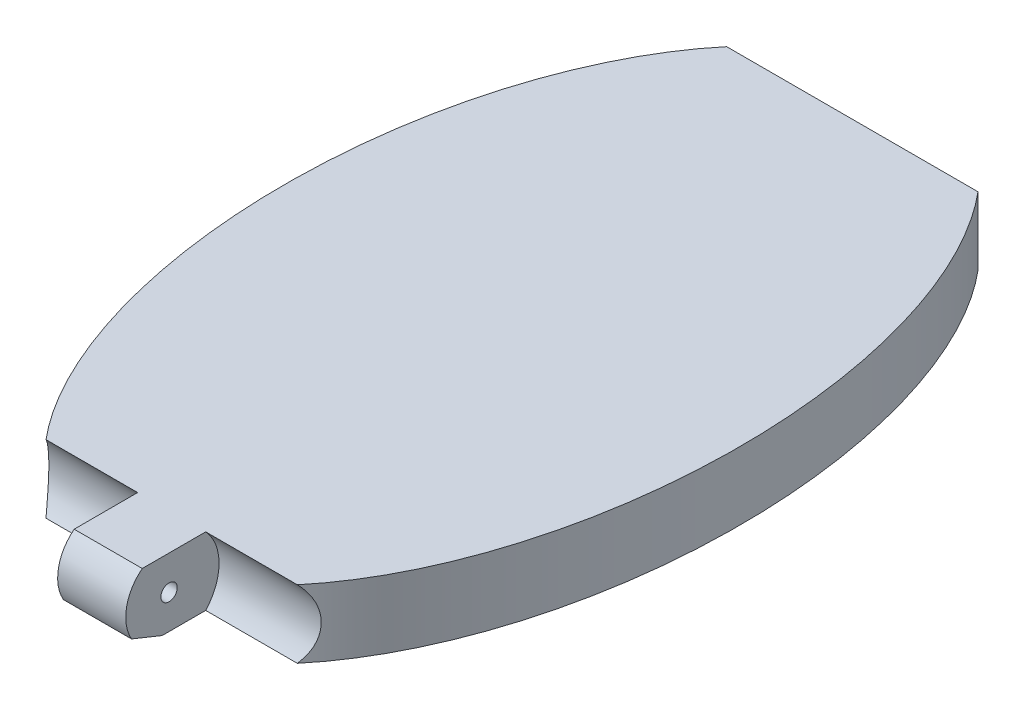
ISO-10303-21;
HEADER;
FILE_DESCRIPTION(('STEP AP214'),'2;1');
FILE_NAME('part.step','',(''),(''),'','','');
FILE_SCHEMA(('AUTOMOTIVE_DESIGN { 1 0 10303 214 1 1 1 1 }'));
ENDSEC;
DATA;
#1=APPLICATION_CONTEXT('core data for automotive mechanical design processes');
#2=APPLICATION_PROTOCOL_DEFINITION('international standard','automotive_design',2000,#1);
#3=PRODUCT_CONTEXT('',#1,'mechanical');
#4=PRODUCT('Part','Part','',(#3));
#5=PRODUCT_RELATED_PRODUCT_CATEGORY('part','',(#4));
#6=PRODUCT_DEFINITION_FORMATION('','',#4);
#7=PRODUCT_DEFINITION_CONTEXT('part definition',#1,'design');
#8=PRODUCT_DEFINITION('design','',#6,#7);
#9=PRODUCT_DEFINITION_SHAPE('','',#8);
#10=(LENGTH_UNIT() NAMED_UNIT(*) SI_UNIT(.MILLI.,.METRE.));
#11=(NAMED_UNIT(*) PLANE_ANGLE_UNIT() SI_UNIT($,.RADIAN.));
#12=(NAMED_UNIT(*) SI_UNIT($,.STERADIAN.) SOLID_ANGLE_UNIT());
#13=UNCERTAINTY_MEASURE_WITH_UNIT(LENGTH_MEASURE(1.E-05),#10,'distance_accuracy_value','');
#14=(GEOMETRIC_REPRESENTATION_CONTEXT(3) GLOBAL_UNCERTAINTY_ASSIGNED_CONTEXT((#13)) GLOBAL_UNIT_ASSIGNED_CONTEXT((#10,
#11,#12)) REPRESENTATION_CONTEXT('',''));
#15=CARTESIAN_POINT('',(0.,0.,0.));
#16=DIRECTION('',(0.,0.,1.));
#17=DIRECTION('',(1.,0.,0.));
#18=AXIS2_PLACEMENT_3D('',#15,#16,#17);
#19=CARTESIAN_POINT('',(0.,6.35,0.));
#20=DIRECTION('',(0.,1.,0.));
#21=DIRECTION('',(0.,0.,-1.));
#22=AXIS2_PLACEMENT_3D('',#19,#20,#21);
#23=ELLIPSE('',#22,38.1,21.209);
#24=DIRECTION('',(0.,-1.,0.));
#25=VECTOR('',#24,1.);
#26=SURFACE_OF_LINEAR_EXTRUSION('',#23,#25);
#27=CARTESIAN_POINT('',(11.723715863108,0.,31.75));
#28=CARTESIAN_POINT('',(11.7845177204,0.0779682282334768,31.6775519988626));
#29=CARTESIAN_POINT('',(11.8431216436233,0.159378838218593,31.6069041341866));
#30=CARTESIAN_POINT('',(11.9556030332646,0.328968422063535,31.4699489385228));
#31=CARTESIAN_POINT('',(12.0094768369523,0.417152543588789,31.403644981114));
#32=CARTESIAN_POINT('',(12.1123478074563,0.600542576899099,31.2758901209959));
#33=CARTESIAN_POINT('',(12.1613172930874,0.69578358601234,31.214467130077));
#34=CARTESIAN_POINT('',(12.2536509356972,0.8924925463359,31.0977181812722));
#35=CARTESIAN_POINT('',(12.297016404684,0.99395903180852,31.0423907967365));
#36=CARTESIAN_POINT('',(12.3779793667619,1.20317024236548,30.9383772547037));
#37=CARTESIAN_POINT('',(12.4155469416906,1.31094381701724,30.8897256797355));
#38=CARTESIAN_POINT('',(12.4842862550226,1.531634743187,30.8001899821188));
#39=CARTESIAN_POINT('',(12.515458580902,1.64455162106877,30.759305146033));
#40=CARTESIAN_POINT('',(12.5710162893371,1.87442920734551,30.6861061711093));
#41=CARTESIAN_POINT('',(12.5954185096747,1.99137905507335,30.6537707787336));
#42=CARTESIAN_POINT('',(12.6372665472636,2.22862225838479,30.598138518997));
#43=CARTESIAN_POINT('',(12.6547132330683,2.3489151945014,30.5748405231259));
#44=CARTESIAN_POINT('',(12.6811536805979,2.5804054421289,30.5394645857841));
#45=CARTESIAN_POINT('',(12.6907852148028,2.6914016994749,30.5265413157279));
#46=CARTESIAN_POINT('',(12.7040747518997,2.91438796091779,30.5086977327822));
#47=CARTESIAN_POINT('',(12.7077331898259,3.02637789204576,30.5037768370615));
#48=CARTESIAN_POINT('',(12.7090406534201,3.25049543143565,30.5020189403686));
#49=CARTESIAN_POINT('',(12.7066875170698,3.36262307472994,30.5051848477554));
#50=CARTESIAN_POINT('',(12.6959909636161,3.58607232564821,30.5195538654204));
#51=CARTESIAN_POINT('',(12.6876476954458,3.69739395324273,30.5307567758739));
#52=CARTESIAN_POINT('',(12.6657147091723,3.91189795798511,30.5601296353567));
#53=CARTESIAN_POINT('',(12.6524597267715,4.01517608593758,30.5778546503782));
#54=CARTESIAN_POINT('',(12.6208223686361,4.21958580553695,30.6200179750436));
#55=CARTESIAN_POINT('',(12.6024383338151,4.32071669120923,30.64445845689));
#56=CARTESIAN_POINT('',(12.5607026167589,4.520128322538,30.6997054144742));
#57=CARTESIAN_POINT('',(12.5373530044793,4.61841023648067,30.7305092374306));
#58=CARTESIAN_POINT('',(12.4858664029791,4.81162608409566,30.7980815308926));
#59=CARTESIAN_POINT('',(12.4577276965156,4.90655880204148,30.8348521407095));
#60=CARTESIAN_POINT('',(12.3639942686122,5.19300297288261,30.9566069382496));
#61=CARTESIAN_POINT('',(12.290739979369,5.37822048866549,31.0508100996239));
#62=CARTESIAN_POINT('',(12.1265002652541,5.72865943260798,31.2585022209354));
#63=CARTESIAN_POINT('',(12.035519136404,5.89388568986632,31.3719865073256));
#64=CARTESIAN_POINT('',(11.9030465800705,6.1011411908023,31.5340257091498));
#65=CARTESIAN_POINT('',(11.8683410788835,6.15275258314609,31.5762192974535));
#66=CARTESIAN_POINT('',(11.7972705507047,6.25332520903655,31.6620481717234));
#67=CARTESIAN_POINT('',(11.7609093689591,6.30229205829715,31.7056800581055));
#68=CARTESIAN_POINT('',(11.723715863108,6.35000000000001,31.75));
#69=B_SPLINE_CURVE_WITH_KNOTS('',3,(#27,#28,#29,#30,#31,#32,#33,#34,#35,#36,#37,#38,#39,#40,#41,
#42,#43,#44,#45,#46,#47,#48,#49,#50,#51,#52,#53,#54,#55,#56,#57,#58,#59,#60,#61,#62,#63,#64,#65,
#66,#67,#68),.UNSPECIFIED.,.F.,.F.,(4,2,2,2,2,2,2,2,2,2,2,2,2,2,2,2,2,2,2,2,4),(0.,
0.367697149456702,0.735676556376303,1.10562797120365,1.47549261576303,1.84720623442146,
2.21888569166802,2.58963229273443,2.96033258332431,3.2963761556501,3.63239525205999,
3.96853521226472,4.30466681527901,4.62117439471767,4.9377844732963,5.25426282728748,
5.5708549020725,6.22898499525695,6.88695579144818,7.11236993974105,7.33728490467142),.UNSPECIFIED.);
#70=CARTESIAN_POINT('',(11.723715863108,0.,31.75));
#71=VERTEX_POINT('',#70);
#72=CARTESIAN_POINT('',(11.723715863108,6.35,31.75));
#73=VERTEX_POINT('',#72);
#74=EDGE_CURVE('E207',#71,#73,#69,.T.);
#75=ORIENTED_EDGE('',*,*,#74,.F.);
#76=CARTESIAN_POINT('',(0.,0.,0.));
#77=DIRECTION('',(0.,1.,0.));
#78=DIRECTION('',(0.,0.,-1.));
#79=AXIS2_PLACEMENT_3D('',#76,#77,#78);
#80=ELLIPSE('',#79,38.1,21.209);
#81=CARTESIAN_POINT('',(11.723715863108,0.,-31.75));
#82=VERTEX_POINT('',#81);
#83=EDGE_CURVE('E56',#71,#82,#80,.T.);
#84=ORIENTED_EDGE('',*,*,#83,.T.);
#85=DIRECTION('',(0.,1.,0.));
#86=VECTOR('',#85,1.);
#87=CARTESIAN_POINT('',(11.723715863108,0.,-31.75));
#88=LINE('',#87,#86);
#89=CARTESIAN_POINT('',(11.723715863108,6.35,-31.75));
#90=VERTEX_POINT('',#89);
#91=EDGE_CURVE('E137',#82,#90,#88,.T.);
#92=ORIENTED_EDGE('',*,*,#91,.T.);
#93=EDGE_CURVE('E131',#73,#90,#23,.T.);
#94=ORIENTED_EDGE('',*,*,#93,.F.);
#95=EDGE_LOOP('',(#75,#84,#92,#94));
#96=FACE_BOUND('',#95,.T.);
#97=ADVANCED_FACE('F33',(#96),#26,.F.);
#98=CARTESIAN_POINT('',(-11.7237158631079,6.35,31.75));
#99=CARTESIAN_POINT('',(-11.7845177204,6.27203177176652,31.6775519988626));
#100=CARTESIAN_POINT('',(-11.8431216436233,6.1906211617814,31.6069041341866));
#101=CARTESIAN_POINT('',(-11.9556030332646,6.02103157793646,31.4699489385228));
#102=CARTESIAN_POINT('',(-12.0094768369522,5.9328474564112,31.403644981114));
#103=CARTESIAN_POINT('',(-12.1123478074563,5.7494574231009,31.2758901209959));
#104=CARTESIAN_POINT('',(-12.1613172930873,5.65421641398765,31.214467130077));
#105=CARTESIAN_POINT('',(-12.2536509356971,5.4575074536641,31.0977181812722));
#106=CARTESIAN_POINT('',(-12.297016404684,5.35604096819148,31.0423907967365));
#107=CARTESIAN_POINT('',(-12.3779793667619,5.14682975763452,30.9383772547037));
#108=CARTESIAN_POINT('',(-12.4155469416906,5.03905618298276,30.8897256797355));
#109=CARTESIAN_POINT('',(-12.4842862550226,4.81836525681299,30.8001899821188));
#110=CARTESIAN_POINT('',(-12.515458580902,4.70544837893123,30.759305146033));
#111=CARTESIAN_POINT('',(-12.5710162893371,4.4755707926545,30.6861061711093));
#112=CARTESIAN_POINT('',(-12.5954185096747,4.35862094492666,30.6537707787336));
#113=CARTESIAN_POINT('',(-12.6372665472636,4.12137774161521,30.598138518997));
#114=CARTESIAN_POINT('',(-12.6547132330683,4.0010848054986,30.5748405231259));
#115=CARTESIAN_POINT('',(-12.6811536805979,3.7695945578711,30.5394645857841));
#116=CARTESIAN_POINT('',(-12.6907852148028,3.65859830052511,30.5265413157279));
#117=CARTESIAN_POINT('',(-12.7040747518997,3.43561203908222,30.5086977327823));
#118=CARTESIAN_POINT('',(-12.7077331898259,3.32362210795424,30.5037768370615));
#119=CARTESIAN_POINT('',(-12.7090406534201,3.09950456856435,30.5020189403686));
#120=CARTESIAN_POINT('',(-12.7066875170698,2.98737692527006,30.5051848477554));
#121=CARTESIAN_POINT('',(-12.6959909636161,2.7639276743518,30.5195538654204));
#122=CARTESIAN_POINT('',(-12.6876476954458,2.65260604675728,30.5307567758739));
#123=CARTESIAN_POINT('',(-12.6657147091723,2.4381020420149,30.5601296353567));
#124=CARTESIAN_POINT('',(-12.6524597267715,2.33482391406242,30.5778546503782));
#125=CARTESIAN_POINT('',(-12.6208223686361,2.13041419446306,30.6200179750436));
#126=CARTESIAN_POINT('',(-12.6024383338151,2.02928330879077,30.64445845689));
#127=CARTESIAN_POINT('',(-12.5607026167589,1.82987167746201,30.6997054144742));
#128=CARTESIAN_POINT('',(-12.5373530044793,1.73158976351934,30.7305092374306));
#129=CARTESIAN_POINT('',(-12.4858664029791,1.53837391590435,30.7980815308926));
#130=CARTESIAN_POINT('',(-12.4577276965156,1.44344119795852,30.8348521407095));
#131=CARTESIAN_POINT('',(-12.3639942686122,1.1569970271174,30.9566069382496));
#132=CARTESIAN_POINT('',(-12.290739979369,0.971779511334517,31.0508100996239));
#133=CARTESIAN_POINT('',(-12.1265002652541,0.621340567392028,31.2585022209354));
#134=CARTESIAN_POINT('',(-12.035519136404,0.456114310133683,31.3719865073256));
#135=CARTESIAN_POINT('',(-11.9030465800705,0.248858809197714,31.5340257091498));
#136=CARTESIAN_POINT('',(-11.8683410788835,0.19724741685392,31.5762192974535));
#137=CARTESIAN_POINT('',(-11.7972705507047,0.096674790963465,31.6620481717234));
#138=CARTESIAN_POINT('',(-11.7609093689591,0.0477079417028635,31.7056800581055));
#139=CARTESIAN_POINT('',(-11.723715863108,0.,31.75));
#140=B_SPLINE_CURVE_WITH_KNOTS('',3,(#98,#99,#100,#101,#102,#103,#104,#105,#106,#107,#108,#109,
#110,#111,#112,#113,#114,#115,#116,#117,#118,#119,#120,#121,#122,#123,#124,#125,#126,#127,#128,
#129,#130,#131,#132,#133,#134,#135,#136,#137,#138,#139),.UNSPECIFIED.,.F.,.F.,(4,2,2,2,2,2,2,2,
2,2,2,2,2,2,2,2,2,2,2,2,4),(0.,0.367697149456702,0.735676556376302,1.10562797120365,
1.47549261576303,1.84720623442145,2.21888569166801,2.58963229273442,2.9603325833243,
3.29637615565009,3.63239525205997,3.96853521226471,4.30466681527899,4.62117439471766,
4.93778447329629,5.25426282728746,5.57085490207249,6.22898499525694,6.88695579144816,
7.11236993974103,7.33728490467139),.UNSPECIFIED.);
#141=CARTESIAN_POINT('',(-11.7237158631079,6.35,31.75));
#142=VERTEX_POINT('',#141);
#143=CARTESIAN_POINT('',(-11.723715863108,0.,31.75));
#144=VERTEX_POINT('',#143);
#145=EDGE_CURVE('E163',#142,#144,#140,.T.);
#146=ORIENTED_EDGE('',*,*,#145,.F.);
#147=CARTESIAN_POINT('',(-11.7237158631079,6.35,-31.75));
#148=VERTEX_POINT('',#147);
#149=EDGE_CURVE('E126',#148,#142,#23,.T.);
#150=ORIENTED_EDGE('',*,*,#149,.F.);
#151=DIRECTION('',(0.,1.,0.));
#152=VECTOR('',#151,1.);
#153=CARTESIAN_POINT('',(-11.7237158631079,0.,-31.75));
#154=LINE('',#153,#152);
#155=CARTESIAN_POINT('',(-11.7237158631079,0.,-31.75));
#156=VERTEX_POINT('',#155);
#157=EDGE_CURVE('E135',#156,#148,#154,.T.);
#158=ORIENTED_EDGE('',*,*,#157,.F.);
#159=EDGE_CURVE('E129',#156,#144,#80,.T.);
#160=ORIENTED_EDGE('',*,*,#159,.T.);
#161=EDGE_LOOP('',(#146,#150,#158,#160));
#162=FACE_BOUND('',#161,.T.);
#163=ADVANCED_FACE('F196',(#162),#26,.F.);
#164=CARTESIAN_POINT('',(0.,6.35,0.));
#165=DIRECTION('',(0.,1.,0.));
#166=DIRECTION('',(0.,0.,1.));
#167=AXIS2_PLACEMENT_3D('',#164,#165,#166);
#168=PLANE('',#167);
#169=DIRECTION('',(-1.,0.,0.));
#170=VECTOR('',#169,1.);
#171=CARTESIAN_POINT('',(21.209,6.35,37.6706653645493));
#172=LINE('',#171,#170);
#173=CARTESIAN_POINT('',(3.175,6.35,37.6706653645493));
#174=VERTEX_POINT('',#173);
#175=CARTESIAN_POINT('',(-3.175,6.35,37.6706653645493));
#176=VERTEX_POINT('',#175);
#177=EDGE_CURVE('E221',#174,#176,#172,.T.);
#178=ORIENTED_EDGE('',*,*,#177,.F.);
#179=DIRECTION('',(0.,0.,1.));
#180=VECTOR('',#179,1.);
#181=CARTESIAN_POINT('',(3.175,6.35,38.1));
#182=LINE('',#181,#180);
#183=CARTESIAN_POINT('',(3.175,6.35,31.75));
#184=VERTEX_POINT('',#183);
#185=EDGE_CURVE('E148',#184,#174,#182,.T.);
#186=ORIENTED_EDGE('',*,*,#185,.F.);
#187=DIRECTION('',(-1.,0.,0.));
#188=VECTOR('',#187,1.);
#189=CARTESIAN_POINT('',(3.175,6.35,31.75));
#190=LINE('',#189,#188);
#191=EDGE_CURVE('E145',#73,#184,#190,.T.);
#192=ORIENTED_EDGE('',*,*,#191,.F.);
#193=ORIENTED_EDGE('',*,*,#93,.T.);
#194=DIRECTION('',(1.,0.,0.));
#195=VECTOR('',#194,1.);
#196=CARTESIAN_POINT('',(-11.7237158631079,6.35,-31.75));
#197=LINE('',#196,#195);
#198=EDGE_CURVE('E140',#148,#90,#197,.T.);
#199=ORIENTED_EDGE('',*,*,#198,.F.);
#200=ORIENTED_EDGE('',*,*,#149,.T.);
#201=DIRECTION('',(-1.,0.,0.));
#202=VECTOR('',#201,1.);
#203=CARTESIAN_POINT('',(-3.175,6.35,31.75));
#204=LINE('',#203,#202);
#205=CARTESIAN_POINT('',(-3.175,6.35,31.75));
#206=VERTEX_POINT('',#205);
#207=EDGE_CURVE('E152',#206,#142,#204,.T.);
#208=ORIENTED_EDGE('',*,*,#207,.F.);
#209=DIRECTION('',(0.,0.,-1.));
#210=VECTOR('',#209,1.);
#211=CARTESIAN_POINT('',(-3.175,6.35,31.75));
#212=LINE('',#211,#210);
#213=EDGE_CURVE('E154',#176,#206,#212,.T.);
#214=ORIENTED_EDGE('',*,*,#213,.F.);
#215=EDGE_LOOP('',(#178,#186,#192,#193,#199,#200,#208,#214));
#216=FACE_BOUND('',#215,.T.);
#217=ADVANCED_FACE('F194',(#216),#168,.T.);
#218=CARTESIAN_POINT('',(0.,0.,0.));
#219=DIRECTION('',(0.,1.,0.));
#220=DIRECTION('',(0.,0.,1.));
#221=AXIS2_PLACEMENT_3D('',#218,#219,#220);
#222=PLANE('',#221);
#223=DIRECTION('',(0.,0.,1.));
#224=VECTOR('',#223,1.);
#225=CARTESIAN_POINT('',(3.175,0.,38.1));
#226=LINE('',#225,#224);
#227=CARTESIAN_POINT('',(3.175,0.,31.75));
#228=VERTEX_POINT('',#227);
#229=CARTESIAN_POINT('',(3.175,0.,35.8089243157879));
#230=VERTEX_POINT('',#229);
#231=EDGE_CURVE('E119',#228,#230,#226,.T.);
#232=ORIENTED_EDGE('',*,*,#231,.T.);
#233=DIRECTION('',(1.,0.,0.));
#234=VECTOR('',#233,1.);
#235=CARTESIAN_POINT('',(-21.209,0.,35.8089243157879));
#236=LINE('',#235,#234);
#237=CARTESIAN_POINT('',(-3.175,0.,35.8089243157879));
#238=VERTEX_POINT('',#237);
#239=EDGE_CURVE('E107',#238,#230,#236,.T.);
#240=ORIENTED_EDGE('',*,*,#239,.F.);
#241=DIRECTION('',(0.,0.,-1.));
#242=VECTOR('',#241,1.);
#243=CARTESIAN_POINT('',(-3.17500000000001,0.,0.));
#244=LINE('',#243,#242);
#245=CARTESIAN_POINT('',(-3.175,0.,31.75));
#246=VERTEX_POINT('',#245);
#247=EDGE_CURVE('E42',#238,#246,#244,.T.);
#248=ORIENTED_EDGE('',*,*,#247,.T.);
#249=DIRECTION('',(-1.,0.,0.));
#250=VECTOR('',#249,1.);
#251=CARTESIAN_POINT('',(-3.175,0.,31.75));
#252=LINE('',#251,#250);
#253=EDGE_CURVE('E150',#246,#144,#252,.T.);
#254=ORIENTED_EDGE('',*,*,#253,.T.);
#255=ORIENTED_EDGE('',*,*,#159,.F.);
#256=DIRECTION('',(1.,0.,0.));
#257=VECTOR('',#256,1.);
#258=CARTESIAN_POINT('',(-11.7237158631079,0.,-31.75));
#259=LINE('',#258,#257);
#260=EDGE_CURVE('E138',#156,#82,#259,.T.);
#261=ORIENTED_EDGE('',*,*,#260,.T.);
#262=ORIENTED_EDGE('',*,*,#83,.F.);
#263=DIRECTION('',(-1.,0.,0.));
#264=VECTOR('',#263,1.);
#265=CARTESIAN_POINT('',(0.,0.,31.75));
#266=LINE('',#265,#264);
#267=EDGE_CURVE('E125',#71,#228,#266,.T.);
#268=ORIENTED_EDGE('',*,*,#267,.T.);
#269=EDGE_LOOP('',(#232,#240,#248,#254,#255,#261,#262,#268));
#270=FACE_BOUND('',#269,.T.);
#271=ADVANCED_FACE('F114',(#270),#222,.F.);
#272=CARTESIAN_POINT('',(-11.7237158631079,0.,-31.75));
#273=DIRECTION('',(0.,0.,1.));
#274=DIRECTION('',(1.,0.,0.));
#275=AXIS2_PLACEMENT_3D('',#272,#273,#274);
#276=PLANE('',#275);
#277=ORIENTED_EDGE('',*,*,#198,.T.);
#278=ORIENTED_EDGE('',*,*,#91,.F.);
#279=ORIENTED_EDGE('',*,*,#260,.F.);
#280=ORIENTED_EDGE('',*,*,#157,.T.);
#281=EDGE_LOOP('',(#277,#278,#279,#280));
#282=FACE_BOUND('',#281,.T.);
#283=ADVANCED_FACE('F189',(#282),#276,.F.);
#284=CARTESIAN_POINT('',(3.175,0.,38.1));
#285=DIRECTION('',(-1.,0.,0.));
#286=DIRECTION('',(0.,0.,1.));
#287=AXIS2_PLACEMENT_3D('',#284,#285,#286);
#288=PLANE('',#287);
#289=CARTESIAN_POINT('',(3.175,3.175,35.1675326822746));
#290=DIRECTION('',(-1.,0.,0.));
#291=DIRECTION('',(0.,0.,1.));
#292=AXIS2_PLACEMENT_3D('',#289,#290,#291);
#293=CIRCLE('',#292,0.761999999999996);
#294=CARTESIAN_POINT('',(3.17500000000001,3.175,35.9295326822746));
#295=VERTEX_POINT('',#294);
#296=EDGE_CURVE('E156',#295,#295,#293,.T.);
#297=ORIENTED_EDGE('',*,*,#296,.T.);
#298=EDGE_LOOP('',(#297));
#299=FACE_BOUND('',#298,.T.);
#300=CARTESIAN_POINT('',(3.175,3.175,35.1675326822746));
#301=DIRECTION('',(-1.,0.,0.));
#302=DIRECTION('',(0.,0.,1.));
#303=AXIS2_PLACEMENT_3D('',#300,#301,#302);
#304=CIRCLE('',#303,4.04305555552622);
#305=CARTESIAN_POINT('',(3.175,1.1561342907156,38.6704570995219));
#306=VERTEX_POINT('',#305);
#307=EDGE_CURVE('E225',#174,#306,#304,.F.);
#308=ORIENTED_EDGE('',*,*,#307,.T.);
#309=DIRECTION('',(0.,-0.374606593415913,-0.927183854566787));
#310=VECTOR('',#309,1.);
#311=CARTESIAN_POINT('',(3.175,0.795757450696489,37.7784931205149));
#312=LINE('',#311,#310);
#313=EDGE_CURVE('E48',#306,#230,#312,.T.);
#314=ORIENTED_EDGE('',*,*,#313,.T.);
#315=ORIENTED_EDGE('',*,*,#231,.F.);
#316=CARTESIAN_POINT('',(3.175,3.175,35.1675326822746));
#317=DIRECTION('',(1.,0.,0.));
#318=DIRECTION('',(0.,0.,-1.));
#319=AXIS2_PLACEMENT_3D('',#316,#317,#318);
#320=CIRCLE('',#319,4.66477809058645);
#321=EDGE_CURVE('E210',#228,#184,#320,.T.);
#322=ORIENTED_EDGE('',*,*,#321,.T.);
#323=ORIENTED_EDGE('',*,*,#185,.T.);
#324=EDGE_LOOP('',(#308,#314,#315,#322,#323));
#325=FACE_BOUND('',#324,.T.);
#326=ADVANCED_FACE('F185',(#299,#325),#288,.F.);
#327=CARTESIAN_POINT('',(-3.175,0.,31.75));
#328=DIRECTION('',(1.,0.,0.));
#329=DIRECTION('',(0.,0.,-1.));
#330=AXIS2_PLACEMENT_3D('',#327,#328,#329);
#331=PLANE('',#330);
#332=CARTESIAN_POINT('',(-3.175,3.175,35.1675326822746));
#333=DIRECTION('',(-1.,0.,0.));
#334=DIRECTION('',(0.,0.,1.));
#335=AXIS2_PLACEMENT_3D('',#332,#333,#334);
#336=CIRCLE('',#335,0.761999999999996);
#337=CARTESIAN_POINT('',(-3.17499999999999,3.175,35.9295326822746));
#338=VERTEX_POINT('',#337);
#339=EDGE_CURVE('E160',#338,#338,#336,.T.);
#340=ORIENTED_EDGE('',*,*,#339,.F.);
#341=EDGE_LOOP('',(#340));
#342=FACE_BOUND('',#341,.T.);
#343=ORIENTED_EDGE('',*,*,#247,.F.);
#344=DIRECTION('',(0.,0.374606593415913,0.927183854566787));
#345=VECTOR('',#344,1.);
#346=CARTESIAN_POINT('',(-3.175,-1.40978287551083,32.3195892544397));
#347=LINE('',#346,#345);
#348=CARTESIAN_POINT('',(-3.175,1.1561342907156,38.6704570995219));
#349=VERTEX_POINT('',#348);
#350=EDGE_CURVE('E104',#238,#349,#347,.T.);
#351=ORIENTED_EDGE('',*,*,#350,.T.);
#352=CARTESIAN_POINT('',(-3.175,3.175,35.1675326822746));
#353=DIRECTION('',(-1.,0.,0.));
#354=DIRECTION('',(0.,0.,1.));
#355=AXIS2_PLACEMENT_3D('',#352,#353,#354);
#356=CIRCLE('',#355,4.04305555552622);
#357=EDGE_CURVE('E226',#349,#176,#356,.T.);
#358=ORIENTED_EDGE('',*,*,#357,.T.);
#359=ORIENTED_EDGE('',*,*,#213,.T.);
#360=CARTESIAN_POINT('',(-3.175,3.175,35.1675326822746));
#361=DIRECTION('',(-1.,0.,0.));
#362=DIRECTION('',(0.,0.,1.));
#363=AXIS2_PLACEMENT_3D('',#360,#361,#362);
#364=CIRCLE('',#363,4.66477809058645);
#365=EDGE_CURVE('E123',#206,#246,#364,.T.);
#366=ORIENTED_EDGE('',*,*,#365,.T.);
#367=EDGE_LOOP('',(#343,#351,#358,#359,#366));
#368=FACE_BOUND('',#367,.T.);
#369=ADVANCED_FACE('F121',(#342,#368),#331,.F.);
#370=CARTESIAN_POINT('',(21.209,3.175,35.1675326822746));
#371=DIRECTION('',(-1.,0.,0.));
#372=DIRECTION('',(0.,0.,1.));
#373=AXIS2_PLACEMENT_3D('',#370,#371,#372);
#374=CYLINDRICAL_SURFACE('',#373,0.761999999999996);
#375=CARTESIAN_POINT('',(-3.17499999999999,3.175,35.9295326822746));
#376=CARTESIAN_POINT('',(-3.10885416666666,3.175,35.9295326822746));
#377=CARTESIAN_POINT('',(-3.04270833333333,3.175,35.9295326822746));
#378=CARTESIAN_POINT('',(-2.91041666666666,3.175,35.9295326822746));
#379=CARTESIAN_POINT('',(-2.84427083333333,3.175,35.9295326822746));
#380=CARTESIAN_POINT('',(-2.71197916666666,3.175,35.9295326822746));
#381=CARTESIAN_POINT('',(-2.64583333333333,3.175,35.9295326822746));
#382=CARTESIAN_POINT('',(-2.51354166666666,3.175,35.9295326822746));
#383=CARTESIAN_POINT('',(-2.44739583333333,3.175,35.9295326822746));
#384=CARTESIAN_POINT('',(-2.31510416666666,3.175,35.9295326822746));
#385=CARTESIAN_POINT('',(-2.24895833333333,3.175,35.9295326822746));
#386=CARTESIAN_POINT('',(-2.11666666666666,3.175,35.9295326822746));
#387=CARTESIAN_POINT('',(-2.05052083333333,3.175,35.9295326822746));
#388=CARTESIAN_POINT('',(-1.91822916666666,3.175,35.9295326822746));
#389=CARTESIAN_POINT('',(-1.85208333333333,3.175,35.9295326822746));
#390=CARTESIAN_POINT('',(-1.71979166666666,3.175,35.9295326822746));
#391=CARTESIAN_POINT('',(-1.65364583333333,3.175,35.9295326822746));
#392=CARTESIAN_POINT('',(-1.52135416666666,3.175,35.9295326822746));
#393=CARTESIAN_POINT('',(-1.45520833333333,3.175,35.9295326822746));
#394=CARTESIAN_POINT('',(-1.32291666666666,3.175,35.9295326822746));
#395=CARTESIAN_POINT('',(-1.25677083333333,3.175,35.9295326822746));
#396=CARTESIAN_POINT('',(-1.12447916666666,3.175,35.9295326822746));
#397=CARTESIAN_POINT('',(-1.05833333333333,3.175,35.9295326822746));
#398=CARTESIAN_POINT('',(-0.926041666666661,3.175,35.9295326822746));
#399=CARTESIAN_POINT('',(-0.859895833333326,3.175,35.9295326822746));
#400=CARTESIAN_POINT('',(-0.727604166666659,3.175,35.9295326822746));
#401=CARTESIAN_POINT('',(-0.661458333333326,3.175,35.9295326822746));
#402=CARTESIAN_POINT('',(-0.52916666666666,3.175,35.9295326822746));
#403=CARTESIAN_POINT('',(-0.463020833333327,3.175,35.9295326822746));
#404=CARTESIAN_POINT('',(-0.33072916666666,3.175,35.9295326822746));
#405=CARTESIAN_POINT('',(-0.264583333333326,3.175,35.9295326822746));
#406=CARTESIAN_POINT('',(-0.132291666666659,3.175,35.9295326822746));
#407=CARTESIAN_POINT('',(-0.066145833333326,3.175,35.9295326822746));
#408=CARTESIAN_POINT('',(0.0661458333333399,3.175,35.9295326822746));
#409=CARTESIAN_POINT('',(0.132291666666673,3.175,35.9295326822746));
#410=CARTESIAN_POINT('',(0.26458333333334,3.175,35.9295326822746));
#411=CARTESIAN_POINT('',(0.330729166666674,3.175,35.9295326822746));
#412=CARTESIAN_POINT('',(0.463020833333341,3.175,35.9295326822746));
#413=CARTESIAN_POINT('',(0.529166666666674,3.175,35.9295326822746));
#414=CARTESIAN_POINT('',(0.66145833333334,3.175,35.9295326822746));
#415=CARTESIAN_POINT('',(0.727604166666673,3.175,35.9295326822746));
#416=CARTESIAN_POINT('',(0.85989583333334,3.175,35.9295326822746));
#417=CARTESIAN_POINT('',(0.926041666666675,3.175,35.9295326822746));
#418=CARTESIAN_POINT('',(1.05833333333334,3.175,35.9295326822746));
#419=CARTESIAN_POINT('',(1.12447916666667,3.175,35.9295326822746));
#420=CARTESIAN_POINT('',(1.25677083333334,3.175,35.9295326822746));
#421=CARTESIAN_POINT('',(1.32291666666667,3.175,35.9295326822746));
#422=CARTESIAN_POINT('',(1.45520833333334,3.175,35.9295326822746));
#423=CARTESIAN_POINT('',(1.52135416666668,3.175,35.9295326822746));
#424=CARTESIAN_POINT('',(1.65364583333334,3.175,35.9295326822746));
#425=CARTESIAN_POINT('',(1.71979166666668,3.175,35.9295326822746));
#426=CARTESIAN_POINT('',(1.85208333333334,3.175,35.9295326822746));
#427=CARTESIAN_POINT('',(1.91822916666667,3.175,35.9295326822746));
#428=CARTESIAN_POINT('',(2.05052083333334,3.175,35.9295326822746));
#429=CARTESIAN_POINT('',(2.11666666666668,3.175,35.9295326822746));
#430=CARTESIAN_POINT('',(2.24895833333334,3.175,35.9295326822746));
#431=CARTESIAN_POINT('',(2.31510416666668,3.175,35.9295326822746));
#432=CARTESIAN_POINT('',(2.44739583333334,3.175,35.9295326822746));
#433=CARTESIAN_POINT('',(2.51354166666667,3.175,35.9295326822746));
#434=CARTESIAN_POINT('',(2.64583333333334,3.175,35.9295326822746));
#435=CARTESIAN_POINT('',(2.71197916666668,3.175,35.9295326822746));
#436=CARTESIAN_POINT('',(2.84427083333334,3.175,35.9295326822746));
#437=CARTESIAN_POINT('',(2.91041666666668,3.175,35.9295326822746));
#438=CARTESIAN_POINT('',(3.04270833333334,3.175,35.9295326822746));
#439=CARTESIAN_POINT('',(3.10885416666667,3.175,35.9295326822746));
#440=CARTESIAN_POINT('',(3.17500000000001,3.175,35.9295326822746));
#441=B_SPLINE_CURVE_WITH_KNOTS('',3,(#375,#376,#377,#378,#379,#380,#381,#382,#383,#384,#385,
#386,#387,#388,#389,#390,#391,#392,#393,#394,#395,#396,#397,#398,#399,#400,#401,#402,#403,#404,
#405,#406,#407,#408,#409,#410,#411,#412,#413,#414,#415,#416,#417,#418,#419,#420,#421,#422,#423,
#424,#425,#426,#427,#428,#429,#430,#431,#432,#433,#434,#435,#436,#437,#438,#439,#440),
.UNSPECIFIED.,.F.,.F.,(4,2,2,2,2,2,2,2,2,2,2,2,2,2,2,2,2,2,2,2,2,2,2,2,2,2,2,2,2,2,2,2,4),(0.,
0.198437499999999,0.396875000000001,0.5953125,0.793749999999999,0.992187500000002,1.190625,
1.3890625,1.5875,1.7859375,1.984375,2.1828125,2.38125,2.5796875,2.778125,2.9765625,3.175,
3.3734375,3.571875,3.7703125,3.96875,4.1671875,4.365625,4.5640625,4.7625,4.9609375,5.159375,
5.3578125,5.55625,5.7546875,5.953125,6.1515625,6.35),.UNSPECIFIED.);
#442=EDGE_CURVE('BSEAM176',#338,#295,#441,.T.);
#443=ORIENTED_EDGE('',*,*,#339,.T.);
#444=ORIENTED_EDGE('',*,*,#296,.F.);
#445=ORIENTED_EDGE('',*,*,#442,.T.);
#446=ORIENTED_EDGE('',*,*,#442,.F.);
#447=EDGE_LOOP('',(#443,#445,#444,#446));
#448=FACE_BOUND('',#447,.T.);
#449=ADVANCED_FACE('F176',(#448),#374,.F.);
#450=CARTESIAN_POINT('',(-21.209,3.175,35.1675326822746));
#451=DIRECTION('',(1.,0.,0.));
#452=DIRECTION('',(0.,0.,-1.));
#453=AXIS2_PLACEMENT_3D('',#450,#451,#452);
#454=CYLINDRICAL_SURFACE('',#453,4.66477809058645);
#455=ORIENTED_EDGE('',*,*,#207,.T.);
#456=ORIENTED_EDGE('',*,*,#145,.T.);
#457=ORIENTED_EDGE('',*,*,#253,.F.);
#458=ORIENTED_EDGE('',*,*,#365,.F.);
#459=EDGE_LOOP('',(#455,#456,#457,#458));
#460=FACE_BOUND('',#459,.T.);
#461=ADVANCED_FACE('F170',(#460),#454,.F.);
#462=CARTESIAN_POINT('',(21.209,3.175,35.1675326822746));
#463=DIRECTION('',(-1.,0.,0.));
#464=DIRECTION('',(0.,0.,1.));
#465=AXIS2_PLACEMENT_3D('',#462,#463,#464);
#466=CYLINDRICAL_SURFACE('',#465,4.66477809058645);
#467=ORIENTED_EDGE('',*,*,#267,.F.);
#468=ORIENTED_EDGE('',*,*,#74,.T.);
#469=ORIENTED_EDGE('',*,*,#191,.T.);
#470=ORIENTED_EDGE('',*,*,#321,.F.);
#471=EDGE_LOOP('',(#467,#468,#469,#470));
#472=FACE_BOUND('',#471,.T.);
#473=ADVANCED_FACE('F175',(#472),#466,.F.);
#474=CARTESIAN_POINT('',(9.70905405973684,3.175,35.1675326822746));
#475=DIRECTION('',(-1.,0.,0.));
#476=DIRECTION('',(0.,0.,1.));
#477=AXIS2_PLACEMENT_3D('',#474,#475,#476);
#478=CYLINDRICAL_SURFACE('',#477,4.04305555552622);
#479=DIRECTION('',(-1.,0.,0.));
#480=VECTOR('',#479,1.);
#481=CARTESIAN_POINT('',(9.70905405973684,1.1561342907156,38.6704570995219));
#482=LINE('',#481,#480);
#483=EDGE_CURVE('E11',#306,#349,#482,.T.);
#484=ORIENTED_EDGE('',*,*,#483,.F.);
#485=ORIENTED_EDGE('',*,*,#307,.F.);
#486=ORIENTED_EDGE('',*,*,#177,.T.);
#487=ORIENTED_EDGE('',*,*,#357,.F.);
#488=EDGE_LOOP('',(#484,#485,#486,#487));
#489=FACE_BOUND('',#488,.T.);
#490=ADVANCED_FACE('F236',(#489),#478,.T.);
#491=CARTESIAN_POINT('',(-21.209,0.,35.8089243157879));
#492=DIRECTION('',(0.,0.927183854566787,-0.374606593415913));
#493=DIRECTION('',(0.,0.374606593415913,0.927183854566787));
#494=AXIS2_PLACEMENT_3D('',#491,#492,#493);
#495=PLANE('',#494);
#496=ORIENTED_EDGE('',*,*,#483,.T.);
#497=ORIENTED_EDGE('',*,*,#350,.F.);
#498=ORIENTED_EDGE('',*,*,#239,.T.);
#499=ORIENTED_EDGE('',*,*,#313,.F.);
#500=EDGE_LOOP('',(#496,#497,#498,#499));
#501=FACE_BOUND('',#500,.T.);
#502=ADVANCED_FACE('F106',(#501),#495,.F.);
#503=CLOSED_SHELL('',(#97,#163,#217,#271,#283,#326,#369,#449,#461,#473,#490,#502));
#504=MANIFOLD_SOLID_BREP('B2',#503);
#505=ADVANCED_BREP_SHAPE_REPRESENTATION('',(#18,#504),#14);
#506=SHAPE_DEFINITION_REPRESENTATION(#9,#505);
ENDSEC;
END-ISO-10303-21;
